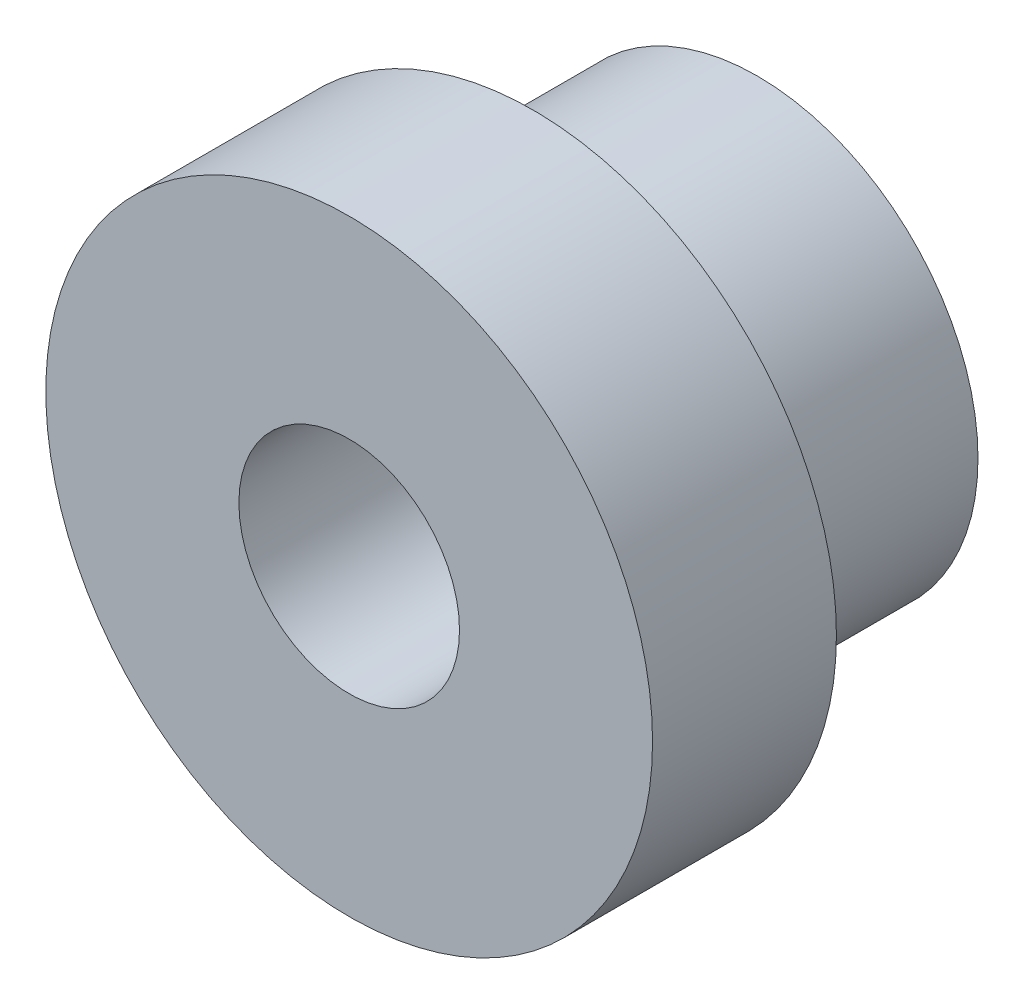
ISO-10303-21;
HEADER;
FILE_DESCRIPTION(('STEP AP214'),'2;1');
FILE_NAME('part.step','',(''),(''),'','','');
FILE_SCHEMA(('AUTOMOTIVE_DESIGN { 1 0 10303 214 1 1 1 1 }'));
ENDSEC;
DATA;
#1=APPLICATION_CONTEXT('core data for automotive mechanical design processes');
#2=APPLICATION_PROTOCOL_DEFINITION('international standard','automotive_design',2000,#1);
#3=PRODUCT_CONTEXT('',#1,'mechanical');
#4=PRODUCT('Part','Part','',(#3));
#5=PRODUCT_RELATED_PRODUCT_CATEGORY('part','',(#4));
#6=PRODUCT_DEFINITION_FORMATION('','',#4);
#7=PRODUCT_DEFINITION_CONTEXT('part definition',#1,'design');
#8=PRODUCT_DEFINITION('design','',#6,#7);
#9=PRODUCT_DEFINITION_SHAPE('','',#8);
#10=(LENGTH_UNIT() NAMED_UNIT(*) SI_UNIT(.MILLI.,.METRE.));
#11=(NAMED_UNIT(*) PLANE_ANGLE_UNIT() SI_UNIT($,.RADIAN.));
#12=(NAMED_UNIT(*) SI_UNIT($,.STERADIAN.) SOLID_ANGLE_UNIT());
#13=UNCERTAINTY_MEASURE_WITH_UNIT(LENGTH_MEASURE(1.E-05),#10,'distance_accuracy_value','');
#14=(GEOMETRIC_REPRESENTATION_CONTEXT(3) GLOBAL_UNCERTAINTY_ASSIGNED_CONTEXT((#13)) GLOBAL_UNIT_ASSIGNED_CONTEXT((#10,
#11,#12)) REPRESENTATION_CONTEXT('',''));
#15=CARTESIAN_POINT('',(0.,0.,0.));
#16=DIRECTION('',(0.,0.,1.));
#17=DIRECTION('',(1.,0.,0.));
#18=AXIS2_PLACEMENT_3D('',#15,#16,#17);
#19=CARTESIAN_POINT('',(0.,0.,11.1));
#20=DIRECTION('',(0.,0.,-1.));
#21=DIRECTION('',(-1.,0.,0.));
#22=AXIS2_PLACEMENT_3D('',#19,#20,#21);
#23=CYLINDRICAL_SURFACE('',#22,6.);
#24=CARTESIAN_POINT('',(0.,0.,0.));
#25=DIRECTION('',(0.,0.,1.));
#26=DIRECTION('',(1.,0.,0.));
#27=AXIS2_PLACEMENT_3D('',#24,#25,#26);
#28=CIRCLE('',#27,6.);
#29=CARTESIAN_POINT('',(6.,0.,0.));
#30=VERTEX_POINT('',#29);
#31=EDGE_CURVE('E33',#30,#30,#28,.T.);
#32=ORIENTED_EDGE('',*,*,#31,.T.);
#33=EDGE_LOOP('',(#32));
#34=FACE_BOUND('',#33,.T.);
#35=CARTESIAN_POINT('',(0.,0.,6.1));
#36=DIRECTION('',(0.,0.,1.));
#37=DIRECTION('',(1.,0.,0.));
#38=AXIS2_PLACEMENT_3D('',#35,#36,#37);
#39=CIRCLE('',#38,6.);
#40=CARTESIAN_POINT('',(6.,0.,6.1));
#41=VERTEX_POINT('',#40);
#42=EDGE_CURVE('E10',#41,#41,#39,.T.);
#43=ORIENTED_EDGE('',*,*,#42,.F.);
#44=EDGE_LOOP('',(#43));
#45=FACE_BOUND('',#44,.T.);
#46=ADVANCED_FACE('F30',(#34,#45),#23,.T.);
#47=CARTESIAN_POINT('',(0.,0.,11.1));
#48=DIRECTION('',(0.,0.,1.));
#49=DIRECTION('',(1.,0.,0.));
#50=AXIS2_PLACEMENT_3D('',#47,#48,#49);
#51=PLANE('',#50);
#52=CARTESIAN_POINT('',(0.,0.,11.1));
#53=DIRECTION('',(0.,0.,1.));
#54=DIRECTION('',(1.,0.,0.));
#55=AXIS2_PLACEMENT_3D('',#52,#53,#54);
#56=CIRCLE('',#55,3.);
#57=CARTESIAN_POINT('',(3.,0.,11.1));
#58=VERTEX_POINT('',#57);
#59=EDGE_CURVE('E41',#58,#58,#56,.T.);
#60=ORIENTED_EDGE('',*,*,#59,.F.);
#61=EDGE_LOOP('',(#60));
#62=FACE_BOUND('',#61,.T.);
#63=CARTESIAN_POINT('',(0.,0.,11.1));
#64=DIRECTION('',(0.,0.,1.));
#65=DIRECTION('',(1.,0.,0.));
#66=AXIS2_PLACEMENT_3D('',#63,#64,#65);
#67=CIRCLE('',#66,8.25);
#68=CARTESIAN_POINT('',(8.25,0.,11.1));
#69=VERTEX_POINT('',#68);
#70=EDGE_CURVE('E44',#69,#69,#67,.T.);
#71=ORIENTED_EDGE('',*,*,#70,.T.);
#72=EDGE_LOOP('',(#71));
#73=FACE_BOUND('',#72,.T.);
#74=ADVANCED_FACE('F58',(#62,#73),#51,.T.);
#75=CARTESIAN_POINT('',(0.,0.,0.));
#76=DIRECTION('',(0.,0.,1.));
#77=DIRECTION('',(1.,0.,0.));
#78=AXIS2_PLACEMENT_3D('',#75,#76,#77);
#79=PLANE('',#78);
#80=ORIENTED_EDGE('',*,*,#31,.F.);
#81=EDGE_LOOP('',(#80));
#82=FACE_BOUND('',#81,.T.);
#83=CARTESIAN_POINT('',(0.,0.,0.));
#84=DIRECTION('',(0.,0.,1.));
#85=DIRECTION('',(1.,0.,0.));
#86=AXIS2_PLACEMENT_3D('',#83,#84,#85);
#87=CIRCLE('',#86,3.);
#88=CARTESIAN_POINT('',(3.,0.,0.));
#89=VERTEX_POINT('',#88);
#90=EDGE_CURVE('E47',#89,#89,#87,.T.);
#91=ORIENTED_EDGE('',*,*,#90,.T.);
#92=EDGE_LOOP('',(#91));
#93=FACE_BOUND('',#92,.T.);
#94=ADVANCED_FACE('F76',(#82,#93),#79,.F.);
#95=CARTESIAN_POINT('',(0.,0.,11.1));
#96=DIRECTION('',(0.,0.,-1.));
#97=DIRECTION('',(-1.,0.,0.));
#98=AXIS2_PLACEMENT_3D('',#95,#96,#97);
#99=CYLINDRICAL_SURFACE('',#98,3.);
#100=ORIENTED_EDGE('',*,*,#59,.T.);
#101=EDGE_LOOP('',(#100));
#102=FACE_BOUND('',#101,.T.);
#103=ORIENTED_EDGE('',*,*,#90,.F.);
#104=EDGE_LOOP('',(#103));
#105=FACE_BOUND('',#104,.T.);
#106=ADVANCED_FACE('F67',(#102,#105),#99,.F.);
#107=CARTESIAN_POINT('',(0.,0.,6.1));
#108=DIRECTION('',(0.,0.,1.));
#109=DIRECTION('',(1.,0.,0.));
#110=AXIS2_PLACEMENT_3D('',#107,#108,#109);
#111=PLANE('',#110);
#112=CARTESIAN_POINT('',(0.,0.,6.1));
#113=DIRECTION('',(0.,0.,1.));
#114=DIRECTION('',(1.,0.,0.));
#115=AXIS2_PLACEMENT_3D('',#112,#113,#114);
#116=CIRCLE('',#115,8.25);
#117=CARTESIAN_POINT('',(8.25,0.,6.1));
#118=VERTEX_POINT('',#117);
#119=EDGE_CURVE('E49',#118,#118,#116,.T.);
#120=ORIENTED_EDGE('',*,*,#119,.F.);
#121=EDGE_LOOP('',(#120));
#122=FACE_BOUND('',#121,.T.);
#123=ORIENTED_EDGE('',*,*,#42,.T.);
#124=EDGE_LOOP('',(#123));
#125=FACE_BOUND('',#124,.T.);
#126=ADVANCED_FACE('F62',(#122,#125),#111,.F.);
#127=CARTESIAN_POINT('',(0.,0.,6.1));
#128=DIRECTION('',(0.,0.,1.));
#129=DIRECTION('',(1.,0.,0.));
#130=AXIS2_PLACEMENT_3D('',#127,#128,#129);
#131=CYLINDRICAL_SURFACE('',#130,8.25);
#132=ORIENTED_EDGE('',*,*,#119,.T.);
#133=EDGE_LOOP('',(#132));
#134=FACE_BOUND('',#133,.T.);
#135=ORIENTED_EDGE('',*,*,#70,.F.);
#136=EDGE_LOOP('',(#135));
#137=FACE_BOUND('',#136,.T.);
#138=ADVANCED_FACE('F60',(#134,#137),#131,.T.);
#139=CLOSED_SHELL('',(#46,#74,#94,#106,#126,#138));
#140=MANIFOLD_SOLID_BREP('B2',#139);
#141=ADVANCED_BREP_SHAPE_REPRESENTATION('',(#18,#140),#14);
#142=SHAPE_DEFINITION_REPRESENTATION(#9,#141);
ENDSEC;
END-ISO-10303-21;
